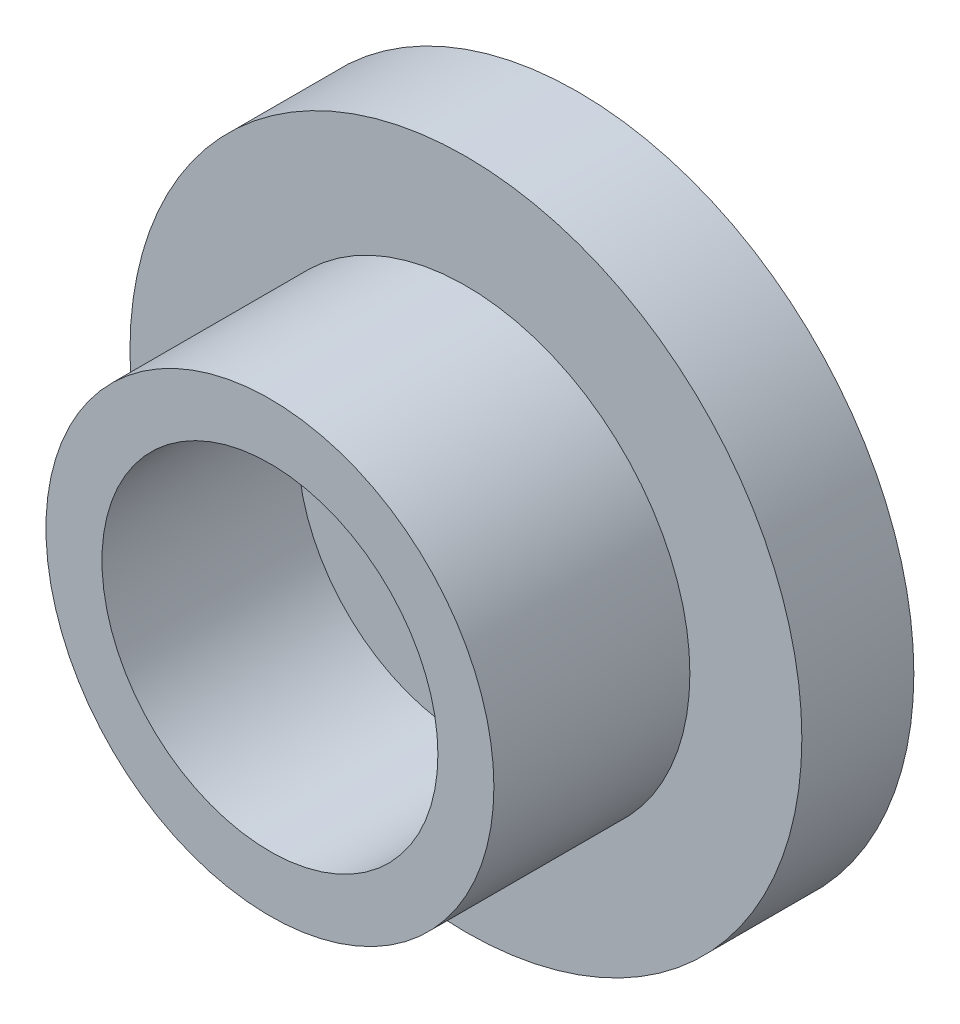
ISO-10303-21;
HEADER;
FILE_DESCRIPTION(('STEP AP214'),'2;1');
FILE_NAME('part.step','',(''),(''),'','','');
FILE_SCHEMA(('AUTOMOTIVE_DESIGN { 1 0 10303 214 1 1 1 1 }'));
ENDSEC;
DATA;
#1=APPLICATION_CONTEXT('core data for automotive mechanical design processes');
#2=APPLICATION_PROTOCOL_DEFINITION('international standard','automotive_design',2000,#1);
#3=PRODUCT_CONTEXT('',#1,'mechanical');
#4=PRODUCT('Part','Part','',(#3));
#5=PRODUCT_RELATED_PRODUCT_CATEGORY('part','',(#4));
#6=PRODUCT_DEFINITION_FORMATION('','',#4);
#7=PRODUCT_DEFINITION_CONTEXT('part definition',#1,'design');
#8=PRODUCT_DEFINITION('design','',#6,#7);
#9=PRODUCT_DEFINITION_SHAPE('','',#8);
#10=(LENGTH_UNIT() NAMED_UNIT(*) SI_UNIT(.MILLI.,.METRE.));
#11=(NAMED_UNIT(*) PLANE_ANGLE_UNIT() SI_UNIT($,.RADIAN.));
#12=(NAMED_UNIT(*) SI_UNIT($,.STERADIAN.) SOLID_ANGLE_UNIT());
#13=UNCERTAINTY_MEASURE_WITH_UNIT(LENGTH_MEASURE(1.E-05),#10,'distance_accuracy_value','');
#14=(GEOMETRIC_REPRESENTATION_CONTEXT(3) GLOBAL_UNCERTAINTY_ASSIGNED_CONTEXT((#13)) GLOBAL_UNIT_ASSIGNED_CONTEXT((#10,
#11,#12)) REPRESENTATION_CONTEXT('',''));
#15=CARTESIAN_POINT('',(0.,0.,0.));
#16=DIRECTION('',(0.,0.,1.));
#17=DIRECTION('',(1.,0.,0.));
#18=AXIS2_PLACEMENT_3D('',#15,#16,#17);
#19=CARTESIAN_POINT('',(0.,0.,2.));
#20=DIRECTION('',(0.,0.,-1.));
#21=DIRECTION('',(-1.,0.,0.));
#22=AXIS2_PLACEMENT_3D('',#19,#20,#21);
#23=CYLINDRICAL_SURFACE('',#22,6.);
#24=CARTESIAN_POINT('',(0.,0.,2.));
#25=DIRECTION('',(0.,0.,1.));
#26=DIRECTION('',(1.,0.,0.));
#27=AXIS2_PLACEMENT_3D('',#24,#25,#26);
#28=CIRCLE('',#27,6.);
#29=CARTESIAN_POINT('',(6.,0.,2.));
#30=VERTEX_POINT('',#29);
#31=EDGE_CURVE('E44',#30,#30,#28,.T.);
#32=ORIENTED_EDGE('',*,*,#31,.F.);
#33=EDGE_LOOP('',(#32));
#34=FACE_BOUND('',#33,.T.);
#35=CARTESIAN_POINT('',(0.,0.,0.));
#36=DIRECTION('',(0.,0.,1.));
#37=DIRECTION('',(1.,0.,0.));
#38=AXIS2_PLACEMENT_3D('',#35,#36,#37);
#39=CIRCLE('',#38,6.);
#40=CARTESIAN_POINT('',(6.,0.,0.));
#41=VERTEX_POINT('',#40);
#42=EDGE_CURVE('E49',#41,#41,#39,.T.);
#43=ORIENTED_EDGE('',*,*,#42,.T.);
#44=EDGE_LOOP('',(#43));
#45=FACE_BOUND('',#44,.T.);
#46=ADVANCED_FACE('F37',(#34,#45),#23,.T.);
#47=CARTESIAN_POINT('',(0.,0.,2.));
#48=DIRECTION('',(0.,0.,1.));
#49=DIRECTION('',(1.,0.,0.));
#50=AXIS2_PLACEMENT_3D('',#47,#48,#49);
#51=PLANE('',#50);
#52=CARTESIAN_POINT('',(0.,0.,2.));
#53=DIRECTION('',(0.,0.,1.));
#54=DIRECTION('',(1.,0.,0.));
#55=AXIS2_PLACEMENT_3D('',#52,#53,#54);
#56=CIRCLE('',#55,4.);
#57=CARTESIAN_POINT('',(4.,0.,2.));
#58=VERTEX_POINT('',#57);
#59=EDGE_CURVE('E57',#58,#58,#56,.T.);
#60=ORIENTED_EDGE('',*,*,#59,.F.);
#61=EDGE_LOOP('',(#60));
#62=FACE_BOUND('',#61,.T.);
#63=ORIENTED_EDGE('',*,*,#31,.T.);
#64=EDGE_LOOP('',(#63));
#65=FACE_BOUND('',#64,.T.);
#66=ADVANCED_FACE('F83',(#62,#65),#51,.T.);
#67=CARTESIAN_POINT('',(0.,0.,0.));
#68=DIRECTION('',(0.,0.,1.));
#69=DIRECTION('',(1.,0.,0.));
#70=AXIS2_PLACEMENT_3D('',#67,#68,#69);
#71=PLANE('',#70);
#72=ORIENTED_EDGE('',*,*,#42,.F.);
#73=EDGE_LOOP('',(#72));
#74=FACE_BOUND('',#73,.T.);
#75=ADVANCED_FACE('F74',(#74),#71,.F.);
#76=CARTESIAN_POINT('',(0.,0.,5.5));
#77=DIRECTION('',(0.,0.,1.));
#78=DIRECTION('',(1.,0.,0.));
#79=AXIS2_PLACEMENT_3D('',#76,#77,#78);
#80=PLANE('',#79);
#81=CARTESIAN_POINT('',(0.,0.,5.5));
#82=DIRECTION('',(0.,0.,1.));
#83=DIRECTION('',(1.,0.,0.));
#84=AXIS2_PLACEMENT_3D('',#81,#82,#83);
#85=CIRCLE('',#84,4.);
#86=CARTESIAN_POINT('',(4.,0.,5.5));
#87=VERTEX_POINT('',#86);
#88=EDGE_CURVE('E55',#87,#87,#85,.T.);
#89=ORIENTED_EDGE('',*,*,#88,.T.);
#90=EDGE_LOOP('',(#89));
#91=FACE_BOUND('',#90,.T.);
#92=CARTESIAN_POINT('',(0.,0.,5.5));
#93=DIRECTION('',(0.,0.,1.));
#94=DIRECTION('',(1.,0.,0.));
#95=AXIS2_PLACEMENT_3D('',#92,#93,#94);
#96=CIRCLE('',#95,3.);
#97=CARTESIAN_POINT('',(3.,0.,5.5));
#98=VERTEX_POINT('',#97);
#99=EDGE_CURVE('E61',#98,#98,#96,.T.);
#100=ORIENTED_EDGE('',*,*,#99,.F.);
#101=EDGE_LOOP('',(#100));
#102=FACE_BOUND('',#101,.T.);
#103=ADVANCED_FACE('F71',(#91,#102),#80,.T.);
#104=CARTESIAN_POINT('',(0.,0.,5.5));
#105=DIRECTION('',(0.,0.,-1.));
#106=DIRECTION('',(-1.,0.,0.));
#107=AXIS2_PLACEMENT_3D('',#104,#105,#106);
#108=CYLINDRICAL_SURFACE('',#107,4.);
#109=ORIENTED_EDGE('',*,*,#88,.F.);
#110=EDGE_LOOP('',(#109));
#111=FACE_BOUND('',#110,.T.);
#112=ORIENTED_EDGE('',*,*,#59,.T.);
#113=EDGE_LOOP('',(#112));
#114=FACE_BOUND('',#113,.T.);
#115=ADVANCED_FACE('F73',(#111,#114),#108,.T.);
#116=CARTESIAN_POINT('',(0.,0.,5.5));
#117=DIRECTION('',(0.,0.,-1.));
#118=DIRECTION('',(-1.,0.,0.));
#119=AXIS2_PLACEMENT_3D('',#116,#117,#118);
#120=CYLINDRICAL_SURFACE('',#119,3.);
#121=ORIENTED_EDGE('',*,*,#99,.T.);
#122=EDGE_LOOP('',(#121));
#123=FACE_BOUND('',#122,.T.);
#124=CARTESIAN_POINT('',(0.,0.,2.));
#125=DIRECTION('',(0.,0.,1.));
#126=DIRECTION('',(1.,0.,0.));
#127=AXIS2_PLACEMENT_3D('',#124,#125,#126);
#128=CIRCLE('',#127,3.);
#129=CARTESIAN_POINT('',(3.,0.,2.));
#130=VERTEX_POINT('',#129);
#131=EDGE_CURVE('E10',#130,#130,#128,.F.);
#132=ORIENTED_EDGE('',*,*,#131,.T.);
#133=EDGE_LOOP('',(#132));
#134=FACE_BOUND('',#133,.T.);
#135=ADVANCED_FACE('F69',(#123,#134),#120,.F.);
#136=ORIENTED_EDGE('',*,*,#131,.F.);
#137=EDGE_LOOP('',(#136));
#138=FACE_BOUND('',#137,.T.);
#139=ADVANCED_FACE('F93',(#138),#51,.T.);
#140=CLOSED_SHELL('',(#46,#66,#75,#103,#115,#135,#139));
#141=MANIFOLD_SOLID_BREP('B2',#140);
#142=ADVANCED_BREP_SHAPE_REPRESENTATION('',(#18,#141),#14);
#143=SHAPE_DEFINITION_REPRESENTATION(#9,#142);
ENDSEC;
END-ISO-10303-21;
